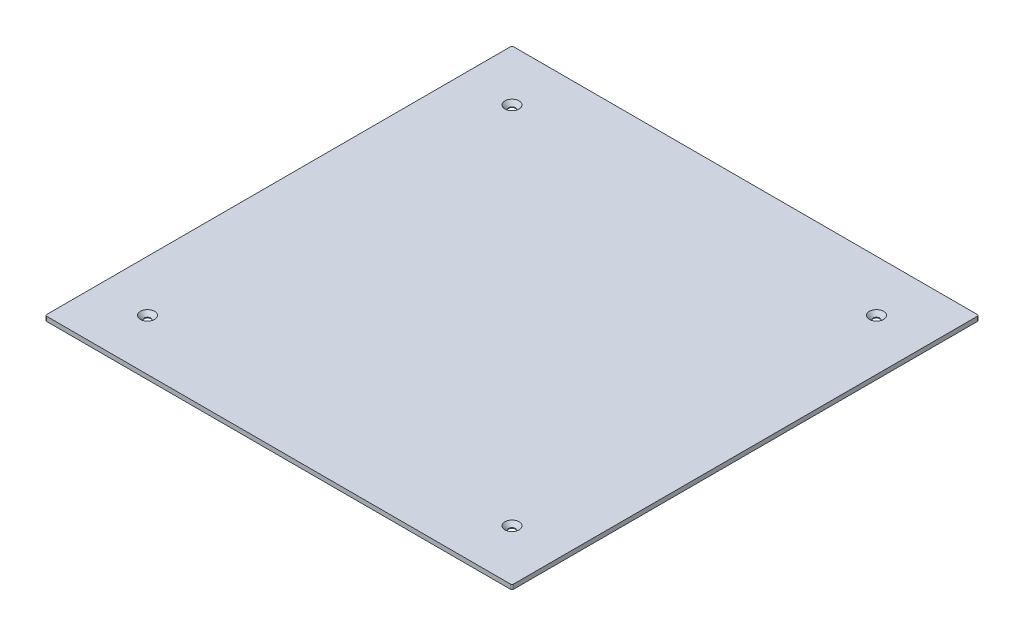
ISO-10303-21;
HEADER;
FILE_DESCRIPTION(('STEP AP214'),'2;1');
FILE_NAME('part.step','',(''),(''),'','','');
FILE_SCHEMA(('AUTOMOTIVE_DESIGN { 1 0 10303 214 1 1 1 1 }'));
ENDSEC;
DATA;
#1=APPLICATION_CONTEXT('core data for automotive mechanical design processes');
#2=APPLICATION_PROTOCOL_DEFINITION('international standard','automotive_design',2000,#1);
#3=PRODUCT_CONTEXT('',#1,'mechanical');
#4=PRODUCT('Part','Part','',(#3));
#5=PRODUCT_RELATED_PRODUCT_CATEGORY('part','',(#4));
#6=PRODUCT_DEFINITION_FORMATION('','',#4);
#7=PRODUCT_DEFINITION_CONTEXT('part definition',#1,'design');
#8=PRODUCT_DEFINITION('design','',#6,#7);
#9=PRODUCT_DEFINITION_SHAPE('','',#8);
#10=(LENGTH_UNIT() NAMED_UNIT(*) SI_UNIT(.MILLI.,.METRE.));
#11=(NAMED_UNIT(*) PLANE_ANGLE_UNIT() SI_UNIT($,.RADIAN.));
#12=(NAMED_UNIT(*) SI_UNIT($,.STERADIAN.) SOLID_ANGLE_UNIT());
#13=UNCERTAINTY_MEASURE_WITH_UNIT(LENGTH_MEASURE(1.E-05),#10,'distance_accuracy_value','');
#14=(GEOMETRIC_REPRESENTATION_CONTEXT(3) GLOBAL_UNCERTAINTY_ASSIGNED_CONTEXT((#13)) GLOBAL_UNIT_ASSIGNED_CONTEXT((#10,
#11,#12)) REPRESENTATION_CONTEXT('',''));
#15=CARTESIAN_POINT('',(0.,0.,0.));
#16=DIRECTION('',(0.,0.,1.));
#17=DIRECTION('',(1.,0.,0.));
#18=AXIS2_PLACEMENT_3D('',#15,#16,#17);
#19=CARTESIAN_POINT('',(0.,0.,0.));
#20=DIRECTION('',(0.,-1.,0.));
#21=DIRECTION('',(0.,0.,-1.));
#22=AXIS2_PLACEMENT_3D('',#19,#20,#21);
#23=PLANE('',#22);
#24=CARTESIAN_POINT('',(276.,0.,-276.));
#25=DIRECTION('',(0.,-1.,0.));
#26=DIRECTION('',(0.,0.,-1.));
#27=AXIS2_PLACEMENT_3D('',#24,#25,#26);
#28=CIRCLE('',#27,3.50000000000002);
#29=CARTESIAN_POINT('',(276.,0.,-279.5));
#30=VERTEX_POINT('',#29);
#31=EDGE_CURVE('E52',#30,#30,#28,.F.);
#32=ORIENTED_EDGE('',*,*,#31,.T.);
#33=EDGE_LOOP('',(#32));
#34=FACE_BOUND('',#33,.T.);
#35=CARTESIAN_POINT('',(34.,0.,-34.));
#36=DIRECTION('',(0.,-1.,0.));
#37=DIRECTION('',(0.,0.,-1.));
#38=AXIS2_PLACEMENT_3D('',#35,#36,#37);
#39=CIRCLE('',#38,3.5033709885952);
#40=CARTESIAN_POINT('',(34.,0.,-37.5033709885952));
#41=VERTEX_POINT('',#40);
#42=EDGE_CURVE('E239',#41,#41,#39,.F.);
#43=ORIENTED_EDGE('',*,*,#42,.T.);
#44=EDGE_LOOP('',(#43));
#45=FACE_BOUND('',#44,.T.);
#46=DIRECTION('',(0.,0.,1.));
#47=VECTOR('',#46,1.);
#48=CARTESIAN_POINT('',(0.,0.,0.));
#49=LINE('',#48,#47);
#50=CARTESIAN_POINT('',(0.,0.,-309.));
#51=VERTEX_POINT('',#50);
#52=CARTESIAN_POINT('',(0.,0.,-1.));
#53=VERTEX_POINT('',#52);
#54=EDGE_CURVE('E128',#51,#53,#49,.T.);
#55=ORIENTED_EDGE('',*,*,#54,.F.);
#56=CARTESIAN_POINT('',(1.,0.,-309.));
#57=DIRECTION('',(0.,-1.,0.));
#58=DIRECTION('',(0.,0.,-1.));
#59=AXIS2_PLACEMENT_3D('',#56,#57,#58);
#60=CIRCLE('',#59,1.);
#61=CARTESIAN_POINT('',(1.,0.,-310.));
#62=VERTEX_POINT('',#61);
#63=EDGE_CURVE('E111',#51,#62,#60,.T.);
#64=ORIENTED_EDGE('',*,*,#63,.T.);
#65=DIRECTION('',(-1.,0.,0.));
#66=VECTOR('',#65,1.);
#67=CARTESIAN_POINT('',(0.,0.,-310.));
#68=LINE('',#67,#66);
#69=CARTESIAN_POINT('',(309.,0.,-310.));
#70=VERTEX_POINT('',#69);
#71=EDGE_CURVE('E208',#70,#62,#68,.T.);
#72=ORIENTED_EDGE('',*,*,#71,.F.);
#73=CARTESIAN_POINT('',(309.,0.,-309.));
#74=DIRECTION('',(0.,-1.,0.));
#75=DIRECTION('',(0.,0.,-1.));
#76=AXIS2_PLACEMENT_3D('',#73,#74,#75);
#77=CIRCLE('',#76,1.);
#78=CARTESIAN_POINT('',(310.,0.,-309.));
#79=VERTEX_POINT('',#78);
#80=EDGE_CURVE('E122',#70,#79,#77,.T.);
#81=ORIENTED_EDGE('',*,*,#80,.T.);
#82=DIRECTION('',(0.,0.,-1.));
#83=VECTOR('',#82,1.);
#84=CARTESIAN_POINT('',(310.,0.,0.));
#85=LINE('',#84,#83);
#86=CARTESIAN_POINT('',(310.,0.,-1.));
#87=VERTEX_POINT('',#86);
#88=EDGE_CURVE('E141',#87,#79,#85,.T.);
#89=ORIENTED_EDGE('',*,*,#88,.F.);
#90=CARTESIAN_POINT('',(309.,0.,-1.));
#91=DIRECTION('',(0.,-1.,0.));
#92=DIRECTION('',(0.,0.,-1.));
#93=AXIS2_PLACEMENT_3D('',#90,#91,#92);
#94=CIRCLE('',#93,1.);
#95=CARTESIAN_POINT('',(309.,0.,0.));
#96=VERTEX_POINT('',#95);
#97=EDGE_CURVE('E217',#87,#96,#94,.T.);
#98=ORIENTED_EDGE('',*,*,#97,.T.);
#99=DIRECTION('',(1.,0.,0.));
#100=VECTOR('',#99,1.);
#101=CARTESIAN_POINT('',(0.,0.,0.));
#102=LINE('',#101,#100);
#103=CARTESIAN_POINT('',(1.,0.,0.));
#104=VERTEX_POINT('',#103);
#105=EDGE_CURVE('E137',#104,#96,#102,.T.);
#106=ORIENTED_EDGE('',*,*,#105,.F.);
#107=CARTESIAN_POINT('',(1.,0.,-1.));
#108=DIRECTION('',(0.,-1.,0.));
#109=DIRECTION('',(0.,0.,-1.));
#110=AXIS2_PLACEMENT_3D('',#107,#108,#109);
#111=CIRCLE('',#110,1.);
#112=EDGE_CURVE('E132',#104,#53,#111,.T.);
#113=ORIENTED_EDGE('',*,*,#112,.T.);
#114=EDGE_LOOP('',(#55,#64,#72,#81,#89,#98,#106,#113));
#115=FACE_BOUND('',#114,.T.);
#116=CARTESIAN_POINT('',(34.,0.,-276.));
#117=DIRECTION('',(0.,-1.,0.));
#118=DIRECTION('',(0.,0.,-1.));
#119=AXIS2_PLACEMENT_3D('',#116,#117,#118);
#120=CIRCLE('',#119,3.49720051600517);
#121=CARTESIAN_POINT('',(34.,0.,-279.497200516005));
#122=VERTEX_POINT('',#121);
#123=EDGE_CURVE('E243',#122,#122,#120,.F.);
#124=ORIENTED_EDGE('',*,*,#123,.T.);
#125=EDGE_LOOP('',(#124));
#126=FACE_BOUND('',#125,.T.);
#127=CARTESIAN_POINT('',(276.,0.,-34.));
#128=DIRECTION('',(0.,-1.,0.));
#129=DIRECTION('',(0.,0.,-1.));
#130=AXIS2_PLACEMENT_3D('',#127,#128,#129);
#131=CIRCLE('',#130,3.50000000000002);
#132=CARTESIAN_POINT('',(276.,0.,-37.5000000000001));
#133=VERTEX_POINT('',#132);
#134=EDGE_CURVE('E12',#133,#133,#131,.F.);
#135=ORIENTED_EDGE('',*,*,#134,.T.);
#136=EDGE_LOOP('',(#135));
#137=FACE_BOUND('',#136,.T.);
#138=ADVANCED_FACE('F43',(#34,#45,#115,#126,#137),#23,.T.);
#139=ORIENTED_EDGE('',*,*,#134,.F.);
#140=EDGE_LOOP('',(#139));
#141=FACE_BOUND('',#140,.T.);
#142=CARTESIAN_POINT('',(276.,0.,-34.));
#143=DIRECTION('',(0.,1.,0.));
#144=DIRECTION('',(0.,0.,1.));
#145=AXIS2_PLACEMENT_3D('',#142,#143,#144);
#146=CIRCLE('',#145,2.14999999999999);
#147=CARTESIAN_POINT('',(276.,0.,-31.85));
#148=VERTEX_POINT('',#147);
#149=EDGE_CURVE('E194',#148,#148,#146,.T.);
#150=ORIENTED_EDGE('',*,*,#149,.T.);
#151=EDGE_LOOP('',(#150));
#152=FACE_BOUND('',#151,.T.);
#153=ADVANCED_FACE('F258',(#141,#152),#23,.T.);
#154=ORIENTED_EDGE('',*,*,#31,.F.);
#155=EDGE_LOOP('',(#154));
#156=FACE_BOUND('',#155,.T.);
#157=CARTESIAN_POINT('',(276.,0.,-276.));
#158=DIRECTION('',(0.,1.,0.));
#159=DIRECTION('',(0.,0.,1.));
#160=AXIS2_PLACEMENT_3D('',#157,#158,#159);
#161=CIRCLE('',#160,2.14999999999999);
#162=CARTESIAN_POINT('',(276.,0.,-273.85));
#163=VERTEX_POINT('',#162);
#164=EDGE_CURVE('E138',#163,#163,#161,.T.);
#165=ORIENTED_EDGE('',*,*,#164,.T.);
#166=EDGE_LOOP('',(#165));
#167=FACE_BOUND('',#166,.T.);
#168=ADVANCED_FACE('F254',(#156,#167),#23,.T.);
#169=ORIENTED_EDGE('',*,*,#123,.F.);
#170=EDGE_LOOP('',(#169));
#171=FACE_BOUND('',#170,.T.);
#172=CARTESIAN_POINT('',(34.,0.,-276.));
#173=DIRECTION('',(0.,1.,0.));
#174=DIRECTION('',(0.,0.,1.));
#175=AXIS2_PLACEMENT_3D('',#172,#173,#174);
#176=CIRCLE('',#175,2.15);
#177=CARTESIAN_POINT('',(34.,0.,-273.85));
#178=VERTEX_POINT('',#177);
#179=EDGE_CURVE('E163',#178,#178,#176,.T.);
#180=ORIENTED_EDGE('',*,*,#179,.T.);
#181=EDGE_LOOP('',(#180));
#182=FACE_BOUND('',#181,.T.);
#183=ADVANCED_FACE('F257',(#171,#182),#23,.T.);
#184=CARTESIAN_POINT('',(0.,3.,0.));
#185=DIRECTION('',(1.,0.,0.));
#186=DIRECTION('',(0.,0.,-1.));
#187=AXIS2_PLACEMENT_3D('',#184,#185,#186);
#188=PLANE('',#187);
#189=DIRECTION('',(0.,0.,1.));
#190=VECTOR('',#189,1.);
#191=CARTESIAN_POINT('',(0.,3.,0.));
#192=LINE('',#191,#190);
#193=CARTESIAN_POINT('',(0.,3.,-309.));
#194=VERTEX_POINT('',#193);
#195=CARTESIAN_POINT('',(0.,3.,-1.));
#196=VERTEX_POINT('',#195);
#197=EDGE_CURVE('E131',#194,#196,#192,.T.);
#198=ORIENTED_EDGE('',*,*,#197,.F.);
#199=DIRECTION('',(0.,-1.,0.));
#200=VECTOR('',#199,1.);
#201=CARTESIAN_POINT('',(0.,3.,-309.));
#202=LINE('',#201,#200);
#203=EDGE_CURVE('E115',#194,#51,#202,.T.);
#204=ORIENTED_EDGE('',*,*,#203,.T.);
#205=ORIENTED_EDGE('',*,*,#54,.T.);
#206=DIRECTION('',(0.,-1.,0.));
#207=VECTOR('',#206,1.);
#208=CARTESIAN_POINT('',(0.,3.,-1.));
#209=LINE('',#208,#207);
#210=EDGE_CURVE('E133',#53,#196,#209,.F.);
#211=ORIENTED_EDGE('',*,*,#210,.T.);
#212=EDGE_LOOP('',(#198,#204,#205,#211));
#213=FACE_BOUND('',#212,.T.);
#214=ADVANCED_FACE('F127',(#213),#188,.F.);
#215=CARTESIAN_POINT('',(0.,3.,0.));
#216=DIRECTION('',(0.,0.,-1.));
#217=DIRECTION('',(-1.,0.,0.));
#218=AXIS2_PLACEMENT_3D('',#215,#216,#217);
#219=PLANE('',#218);
#220=ORIENTED_EDGE('',*,*,#105,.T.);
#221=DIRECTION('',(0.,-1.,0.));
#222=VECTOR('',#221,1.);
#223=CARTESIAN_POINT('',(309.,3.,0.));
#224=LINE('',#223,#222);
#225=CARTESIAN_POINT('',(309.,3.,0.));
#226=VERTEX_POINT('',#225);
#227=EDGE_CURVE('E237',#96,#226,#224,.F.);
#228=ORIENTED_EDGE('',*,*,#227,.T.);
#229=DIRECTION('',(1.,0.,0.));
#230=VECTOR('',#229,1.);
#231=CARTESIAN_POINT('',(0.,3.,0.));
#232=LINE('',#231,#230);
#233=CARTESIAN_POINT('',(1.,3.,0.));
#234=VERTEX_POINT('',#233);
#235=EDGE_CURVE('E207',#234,#226,#232,.T.);
#236=ORIENTED_EDGE('',*,*,#235,.F.);
#237=DIRECTION('',(0.,-1.,0.));
#238=VECTOR('',#237,1.);
#239=CARTESIAN_POINT('',(1.,3.,0.));
#240=LINE('',#239,#238);
#241=EDGE_CURVE('E234',#234,#104,#240,.T.);
#242=ORIENTED_EDGE('',*,*,#241,.T.);
#243=EDGE_LOOP('',(#220,#228,#236,#242));
#244=FACE_BOUND('',#243,.T.);
#245=ADVANCED_FACE('F301',(#244),#219,.F.);
#246=CARTESIAN_POINT('',(310.,3.,0.));
#247=DIRECTION('',(-1.,0.,0.));
#248=DIRECTION('',(0.,0.,1.));
#249=AXIS2_PLACEMENT_3D('',#246,#247,#248);
#250=PLANE('',#249);
#251=ORIENTED_EDGE('',*,*,#88,.T.);
#252=DIRECTION('',(0.,-1.,0.));
#253=VECTOR('',#252,1.);
#254=CARTESIAN_POINT('',(310.,3.,-309.));
#255=LINE('',#254,#253);
#256=CARTESIAN_POINT('',(310.,3.,-309.));
#257=VERTEX_POINT('',#256);
#258=EDGE_CURVE('E59',#79,#257,#255,.F.);
#259=ORIENTED_EDGE('',*,*,#258,.T.);
#260=DIRECTION('',(0.,0.,-1.));
#261=VECTOR('',#260,1.);
#262=CARTESIAN_POINT('',(310.,3.,0.));
#263=LINE('',#262,#261);
#264=CARTESIAN_POINT('',(310.,3.,-1.));
#265=VERTEX_POINT('',#264);
#266=EDGE_CURVE('E209',#265,#257,#263,.T.);
#267=ORIENTED_EDGE('',*,*,#266,.F.);
#268=DIRECTION('',(0.,-1.,0.));
#269=VECTOR('',#268,1.);
#270=CARTESIAN_POINT('',(310.,3.,-1.));
#271=LINE('',#270,#269);
#272=EDGE_CURVE('E230',#265,#87,#271,.T.);
#273=ORIENTED_EDGE('',*,*,#272,.T.);
#274=EDGE_LOOP('',(#251,#259,#267,#273));
#275=FACE_BOUND('',#274,.T.);
#276=ADVANCED_FACE('F287',(#275),#250,.F.);
#277=CARTESIAN_POINT('',(0.,3.,-310.));
#278=DIRECTION('',(0.,0.,1.));
#279=DIRECTION('',(1.,0.,0.));
#280=AXIS2_PLACEMENT_3D('',#277,#278,#279);
#281=PLANE('',#280);
#282=ORIENTED_EDGE('',*,*,#71,.T.);
#283=DIRECTION('',(0.,-1.,0.));
#284=VECTOR('',#283,1.);
#285=CARTESIAN_POINT('',(1.,3.,-310.));
#286=LINE('',#285,#284);
#287=CARTESIAN_POINT('',(1.,3.,-310.));
#288=VERTEX_POINT('',#287);
#289=EDGE_CURVE('E116',#62,#288,#286,.F.);
#290=ORIENTED_EDGE('',*,*,#289,.T.);
#291=DIRECTION('',(-1.,0.,0.));
#292=VECTOR('',#291,1.);
#293=CARTESIAN_POINT('',(0.,3.,-310.));
#294=LINE('',#293,#292);
#295=CARTESIAN_POINT('',(309.,3.,-310.));
#296=VERTEX_POINT('',#295);
#297=EDGE_CURVE('E147',#296,#288,#294,.T.);
#298=ORIENTED_EDGE('',*,*,#297,.F.);
#299=DIRECTION('',(0.,-1.,0.));
#300=VECTOR('',#299,1.);
#301=CARTESIAN_POINT('',(309.,3.,-310.));
#302=LINE('',#301,#300);
#303=EDGE_CURVE('E121',#296,#70,#302,.T.);
#304=ORIENTED_EDGE('',*,*,#303,.T.);
#305=EDGE_LOOP('',(#282,#290,#298,#304));
#306=FACE_BOUND('',#305,.T.);
#307=ADVANCED_FACE('F278',(#306),#281,.F.);
#308=CARTESIAN_POINT('',(0.,3.,0.));
#309=DIRECTION('',(0.,-1.,0.));
#310=DIRECTION('',(0.,0.,-1.));
#311=AXIS2_PLACEMENT_3D('',#308,#309,#310);
#312=PLANE('',#311);
#313=CARTESIAN_POINT('',(34.,3.,-276.));
#314=DIRECTION('',(0.,1.,0.));
#315=DIRECTION('',(0.,0.,1.));
#316=AXIS2_PLACEMENT_3D('',#313,#314,#315);
#317=CIRCLE('',#316,4.7);
#318=CARTESIAN_POINT('',(34.,3.,-271.3));
#319=VERTEX_POINT('',#318);
#320=EDGE_CURVE('E164',#319,#319,#317,.T.);
#321=ORIENTED_EDGE('',*,*,#320,.F.);
#322=EDGE_LOOP('',(#321));
#323=FACE_BOUND('',#322,.T.);
#324=CARTESIAN_POINT('',(34.,3.,-34.));
#325=DIRECTION('',(0.,1.,0.));
#326=DIRECTION('',(0.,0.,1.));
#327=AXIS2_PLACEMENT_3D('',#324,#325,#326);
#328=CIRCLE('',#327,4.7);
#329=CARTESIAN_POINT('',(34.,3.,-29.3));
#330=VERTEX_POINT('',#329);
#331=EDGE_CURVE('E169',#330,#330,#328,.T.);
#332=ORIENTED_EDGE('',*,*,#331,.F.);
#333=EDGE_LOOP('',(#332));
#334=FACE_BOUND('',#333,.T.);
#335=CARTESIAN_POINT('',(276.,3.,-34.));
#336=DIRECTION('',(0.,1.,0.));
#337=DIRECTION('',(0.,0.,1.));
#338=AXIS2_PLACEMENT_3D('',#335,#336,#337);
#339=CIRCLE('',#338,4.69999999999998);
#340=CARTESIAN_POINT('',(276.,3.,-29.3));
#341=VERTEX_POINT('',#340);
#342=EDGE_CURVE('E185',#341,#341,#339,.T.);
#343=ORIENTED_EDGE('',*,*,#342,.F.);
#344=EDGE_LOOP('',(#343));
#345=FACE_BOUND('',#344,.T.);
#346=CARTESIAN_POINT('',(276.,3.,-276.));
#347=DIRECTION('',(0.,1.,0.));
#348=DIRECTION('',(0.,0.,1.));
#349=AXIS2_PLACEMENT_3D('',#346,#347,#348);
#350=CIRCLE('',#349,4.69999999999998);
#351=CARTESIAN_POINT('',(276.,3.,-271.3));
#352=VERTEX_POINT('',#351);
#353=EDGE_CURVE('E198',#352,#352,#350,.T.);
#354=ORIENTED_EDGE('',*,*,#353,.F.);
#355=EDGE_LOOP('',(#354));
#356=FACE_BOUND('',#355,.T.);
#357=ORIENTED_EDGE('',*,*,#297,.T.);
#358=CARTESIAN_POINT('',(1.,3.,-309.));
#359=DIRECTION('',(0.,-1.,0.));
#360=DIRECTION('',(0.,0.,-1.));
#361=AXIS2_PLACEMENT_3D('',#358,#359,#360);
#362=CIRCLE('',#361,1.);
#363=EDGE_CURVE('E228',#288,#194,#362,.F.);
#364=ORIENTED_EDGE('',*,*,#363,.T.);
#365=ORIENTED_EDGE('',*,*,#197,.T.);
#366=CARTESIAN_POINT('',(1.,3.,-1.));
#367=DIRECTION('',(0.,-1.,0.));
#368=DIRECTION('',(0.,0.,-1.));
#369=AXIS2_PLACEMENT_3D('',#366,#367,#368);
#370=CIRCLE('',#369,1.);
#371=EDGE_CURVE('E223',#196,#234,#370,.F.);
#372=ORIENTED_EDGE('',*,*,#371,.T.);
#373=ORIENTED_EDGE('',*,*,#235,.T.);
#374=CARTESIAN_POINT('',(309.,3.,-1.));
#375=DIRECTION('',(0.,-1.,0.));
#376=DIRECTION('',(0.,0.,-1.));
#377=AXIS2_PLACEMENT_3D('',#374,#375,#376);
#378=CIRCLE('',#377,1.);
#379=EDGE_CURVE('E66',#226,#265,#378,.F.);
#380=ORIENTED_EDGE('',*,*,#379,.T.);
#381=ORIENTED_EDGE('',*,*,#266,.T.);
#382=CARTESIAN_POINT('',(309.,3.,-309.));
#383=DIRECTION('',(0.,-1.,0.));
#384=DIRECTION('',(0.,0.,-1.));
#385=AXIS2_PLACEMENT_3D('',#382,#383,#384);
#386=CIRCLE('',#385,1.);
#387=EDGE_CURVE('E226',#257,#296,#386,.F.);
#388=ORIENTED_EDGE('',*,*,#387,.T.);
#389=EDGE_LOOP('',(#357,#364,#365,#372,#373,#380,#381,#388));
#390=FACE_BOUND('',#389,.T.);
#391=ADVANCED_FACE('F275',(#323,#334,#345,#356,#390),#312,.F.);
#392=ORIENTED_EDGE('',*,*,#42,.F.);
#393=EDGE_LOOP('',(#392));
#394=FACE_BOUND('',#393,.T.);
#395=CARTESIAN_POINT('',(34.,0.,-34.));
#396=DIRECTION('',(0.,1.,0.));
#397=DIRECTION('',(0.,0.,1.));
#398=AXIS2_PLACEMENT_3D('',#395,#396,#397);
#399=CIRCLE('',#398,2.15);
#400=CARTESIAN_POINT('',(34.,0.,-31.85));
#401=VERTEX_POINT('',#400);
#402=EDGE_CURVE('E181',#401,#401,#399,.T.);
#403=ORIENTED_EDGE('',*,*,#402,.T.);
#404=EDGE_LOOP('',(#403));
#405=FACE_BOUND('',#404,.T.);
#406=ADVANCED_FACE('F277',(#394,#405),#23,.T.);
#407=CARTESIAN_POINT('',(1.,3.,-309.));
#408=DIRECTION('',(0.,-1.,0.));
#409=DIRECTION('',(0.,0.,-1.));
#410=AXIS2_PLACEMENT_3D('',#407,#408,#409);
#411=CYLINDRICAL_SURFACE('',#410,1.);
#412=ORIENTED_EDGE('',*,*,#363,.F.);
#413=ORIENTED_EDGE('',*,*,#289,.F.);
#414=ORIENTED_EDGE('',*,*,#63,.F.);
#415=ORIENTED_EDGE('',*,*,#203,.F.);
#416=EDGE_LOOP('',(#412,#413,#414,#415));
#417=FACE_BOUND('',#416,.T.);
#418=ADVANCED_FACE('F114',(#417),#411,.T.);
#419=CARTESIAN_POINT('',(309.,3.,-309.));
#420=DIRECTION('',(0.,-1.,0.));
#421=DIRECTION('',(0.,0.,-1.));
#422=AXIS2_PLACEMENT_3D('',#419,#420,#421);
#423=CYLINDRICAL_SURFACE('',#422,1.);
#424=ORIENTED_EDGE('',*,*,#387,.F.);
#425=ORIENTED_EDGE('',*,*,#258,.F.);
#426=ORIENTED_EDGE('',*,*,#80,.F.);
#427=ORIENTED_EDGE('',*,*,#303,.F.);
#428=EDGE_LOOP('',(#424,#425,#426,#427));
#429=FACE_BOUND('',#428,.T.);
#430=ADVANCED_FACE('F309',(#429),#423,.T.);
#431=CARTESIAN_POINT('',(309.,3.,-1.));
#432=DIRECTION('',(0.,-1.,0.));
#433=DIRECTION('',(0.,0.,-1.));
#434=AXIS2_PLACEMENT_3D('',#431,#432,#433);
#435=CYLINDRICAL_SURFACE('',#434,1.);
#436=ORIENTED_EDGE('',*,*,#379,.F.);
#437=ORIENTED_EDGE('',*,*,#227,.F.);
#438=ORIENTED_EDGE('',*,*,#97,.F.);
#439=ORIENTED_EDGE('',*,*,#272,.F.);
#440=EDGE_LOOP('',(#436,#437,#438,#439));
#441=FACE_BOUND('',#440,.T.);
#442=ADVANCED_FACE('F311',(#441),#435,.T.);
#443=CARTESIAN_POINT('',(1.,3.,-1.));
#444=DIRECTION('',(0.,-1.,0.));
#445=DIRECTION('',(0.,0.,-1.));
#446=AXIS2_PLACEMENT_3D('',#443,#444,#445);
#447=CYLINDRICAL_SURFACE('',#446,1.);
#448=ORIENTED_EDGE('',*,*,#371,.F.);
#449=ORIENTED_EDGE('',*,*,#210,.F.);
#450=ORIENTED_EDGE('',*,*,#112,.F.);
#451=ORIENTED_EDGE('',*,*,#241,.F.);
#452=EDGE_LOOP('',(#448,#449,#450,#451));
#453=FACE_BOUND('',#452,.T.);
#454=ADVANCED_FACE('F45',(#453),#447,.T.);
#455=CARTESIAN_POINT('',(276.,3.,-276.));
#456=DIRECTION('',(0.,1.,0.));
#457=DIRECTION('',(0.,0.,1.));
#458=AXIS2_PLACEMENT_3D('',#455,#456,#457);
#459=CYLINDRICAL_SURFACE('',#458,2.14999999999999);
#460=ORIENTED_EDGE('',*,*,#164,.F.);
#461=EDGE_LOOP('',(#460));
#462=FACE_BOUND('',#461,.T.);
#463=CARTESIAN_POINT('',(276.,0.449999999999999,-276.));
#464=DIRECTION('',(0.,1.,0.));
#465=DIRECTION('',(0.,0.,1.));
#466=AXIS2_PLACEMENT_3D('',#463,#464,#465);
#467=CIRCLE('',#466,2.14999999999999);
#468=CARTESIAN_POINT('',(276.,0.449999999999999,-273.85));
#469=VERTEX_POINT('',#468);
#470=EDGE_CURVE('E144',#469,#469,#467,.T.);
#471=ORIENTED_EDGE('',*,*,#470,.T.);
#472=EDGE_LOOP('',(#471));
#473=FACE_BOUND('',#472,.T.);
#474=ADVANCED_FACE('F262',(#462,#473),#459,.F.);
#475=CARTESIAN_POINT('',(276.,3.,-276.));
#476=DIRECTION('',(0.,1.,0.));
#477=DIRECTION('',(0.,0.,1.));
#478=AXIS2_PLACEMENT_3D('',#475,#476,#477);
#479=CONICAL_SURFACE('',#478,4.69999999999998,0.785398163397447);
#480=ORIENTED_EDGE('',*,*,#470,.F.);
#481=EDGE_LOOP('',(#480));
#482=FACE_BOUND('',#481,.T.);
#483=ORIENTED_EDGE('',*,*,#353,.T.);
#484=EDGE_LOOP('',(#483));
#485=FACE_BOUND('',#484,.T.);
#486=ADVANCED_FACE('F265',(#482,#485),#479,.F.);
#487=CARTESIAN_POINT('',(276.,3.,-34.));
#488=DIRECTION('',(0.,1.,0.));
#489=DIRECTION('',(0.,0.,1.));
#490=AXIS2_PLACEMENT_3D('',#487,#488,#489);
#491=CYLINDRICAL_SURFACE('',#490,2.14999999999999);
#492=ORIENTED_EDGE('',*,*,#149,.F.);
#493=EDGE_LOOP('',(#492));
#494=FACE_BOUND('',#493,.T.);
#495=CARTESIAN_POINT('',(276.,0.449999999999999,-34.));
#496=DIRECTION('',(0.,1.,0.));
#497=DIRECTION('',(0.,0.,1.));
#498=AXIS2_PLACEMENT_3D('',#495,#496,#497);
#499=CIRCLE('',#498,2.14999999999999);
#500=CARTESIAN_POINT('',(276.,0.449999999999999,-31.85));
#501=VERTEX_POINT('',#500);
#502=EDGE_CURVE('E189',#501,#501,#499,.T.);
#503=ORIENTED_EDGE('',*,*,#502,.T.);
#504=EDGE_LOOP('',(#503));
#505=FACE_BOUND('',#504,.T.);
#506=ADVANCED_FACE('F271',(#494,#505),#491,.F.);
#507=CARTESIAN_POINT('',(276.,3.,-34.));
#508=DIRECTION('',(0.,1.,0.));
#509=DIRECTION('',(0.,0.,1.));
#510=AXIS2_PLACEMENT_3D('',#507,#508,#509);
#511=CONICAL_SURFACE('',#510,4.69999999999998,0.785398163397447);
#512=ORIENTED_EDGE('',*,*,#502,.F.);
#513=EDGE_LOOP('',(#512));
#514=FACE_BOUND('',#513,.T.);
#515=ORIENTED_EDGE('',*,*,#342,.T.);
#516=EDGE_LOOP('',(#515));
#517=FACE_BOUND('',#516,.T.);
#518=ADVANCED_FACE('F342',(#514,#517),#511,.F.);
#519=CARTESIAN_POINT('',(34.,3.,-34.));
#520=DIRECTION('',(0.,1.,0.));
#521=DIRECTION('',(0.,0.,1.));
#522=AXIS2_PLACEMENT_3D('',#519,#520,#521);
#523=CYLINDRICAL_SURFACE('',#522,2.15);
#524=ORIENTED_EDGE('',*,*,#402,.F.);
#525=EDGE_LOOP('',(#524));
#526=FACE_BOUND('',#525,.T.);
#527=CARTESIAN_POINT('',(34.,0.449999999999999,-34.));
#528=DIRECTION('',(0.,1.,0.));
#529=DIRECTION('',(0.,0.,1.));
#530=AXIS2_PLACEMENT_3D('',#527,#528,#529);
#531=CIRCLE('',#530,2.15);
#532=CARTESIAN_POINT('',(34.,0.449999999999999,-31.85));
#533=VERTEX_POINT('',#532);
#534=EDGE_CURVE('E173',#533,#533,#531,.T.);
#535=ORIENTED_EDGE('',*,*,#534,.T.);
#536=EDGE_LOOP('',(#535));
#537=FACE_BOUND('',#536,.T.);
#538=ADVANCED_FACE('F350',(#526,#537),#523,.F.);
#539=CARTESIAN_POINT('',(34.,3.,-34.));
#540=DIRECTION('',(0.,1.,0.));
#541=DIRECTION('',(0.,0.,1.));
#542=AXIS2_PLACEMENT_3D('',#539,#540,#541);
#543=CONICAL_SURFACE('',#542,4.7,0.785398163397449);
#544=ORIENTED_EDGE('',*,*,#534,.F.);
#545=EDGE_LOOP('',(#544));
#546=FACE_BOUND('',#545,.T.);
#547=ORIENTED_EDGE('',*,*,#331,.T.);
#548=EDGE_LOOP('',(#547));
#549=FACE_BOUND('',#548,.T.);
#550=ADVANCED_FACE('F358',(#546,#549),#543,.F.);
#551=CARTESIAN_POINT('',(34.,3.,-276.));
#552=DIRECTION('',(0.,1.,0.));
#553=DIRECTION('',(0.,0.,1.));
#554=AXIS2_PLACEMENT_3D('',#551,#552,#553);
#555=CYLINDRICAL_SURFACE('',#554,2.15);
#556=ORIENTED_EDGE('',*,*,#179,.F.);
#557=EDGE_LOOP('',(#556));
#558=FACE_BOUND('',#557,.T.);
#559=CARTESIAN_POINT('',(34.,0.449999999999999,-276.));
#560=DIRECTION('',(0.,1.,0.));
#561=DIRECTION('',(0.,0.,1.));
#562=AXIS2_PLACEMENT_3D('',#559,#560,#561);
#563=CIRCLE('',#562,2.15);
#564=CARTESIAN_POINT('',(34.,0.449999999999999,-273.85));
#565=VERTEX_POINT('',#564);
#566=EDGE_CURVE('E160',#565,#565,#563,.T.);
#567=ORIENTED_EDGE('',*,*,#566,.T.);
#568=EDGE_LOOP('',(#567));
#569=FACE_BOUND('',#568,.T.);
#570=ADVANCED_FACE('F366',(#558,#569),#555,.F.);
#571=CARTESIAN_POINT('',(34.,3.,-276.));
#572=DIRECTION('',(0.,1.,0.));
#573=DIRECTION('',(0.,0.,1.));
#574=AXIS2_PLACEMENT_3D('',#571,#572,#573);
#575=CONICAL_SURFACE('',#574,4.7,0.785398163397449);
#576=ORIENTED_EDGE('',*,*,#566,.F.);
#577=EDGE_LOOP('',(#576));
#578=FACE_BOUND('',#577,.T.);
#579=ORIENTED_EDGE('',*,*,#320,.T.);
#580=EDGE_LOOP('',(#579));
#581=FACE_BOUND('',#580,.T.);
#582=ADVANCED_FACE('F374',(#578,#581),#575,.F.);
#583=CLOSED_SHELL('',(#138,#153,#168,#183,#214,#245,#276,#307,#391,#406,#418,#430,#442,#454,
#474,#486,#506,#518,#538,#550,#570,#582));
#584=MANIFOLD_SOLID_BREP('B2',#583);
#585=ADVANCED_BREP_SHAPE_REPRESENTATION('',(#18,#584),#14);
#586=SHAPE_DEFINITION_REPRESENTATION(#9,#585);
ENDSEC;
END-ISO-10303-21;
